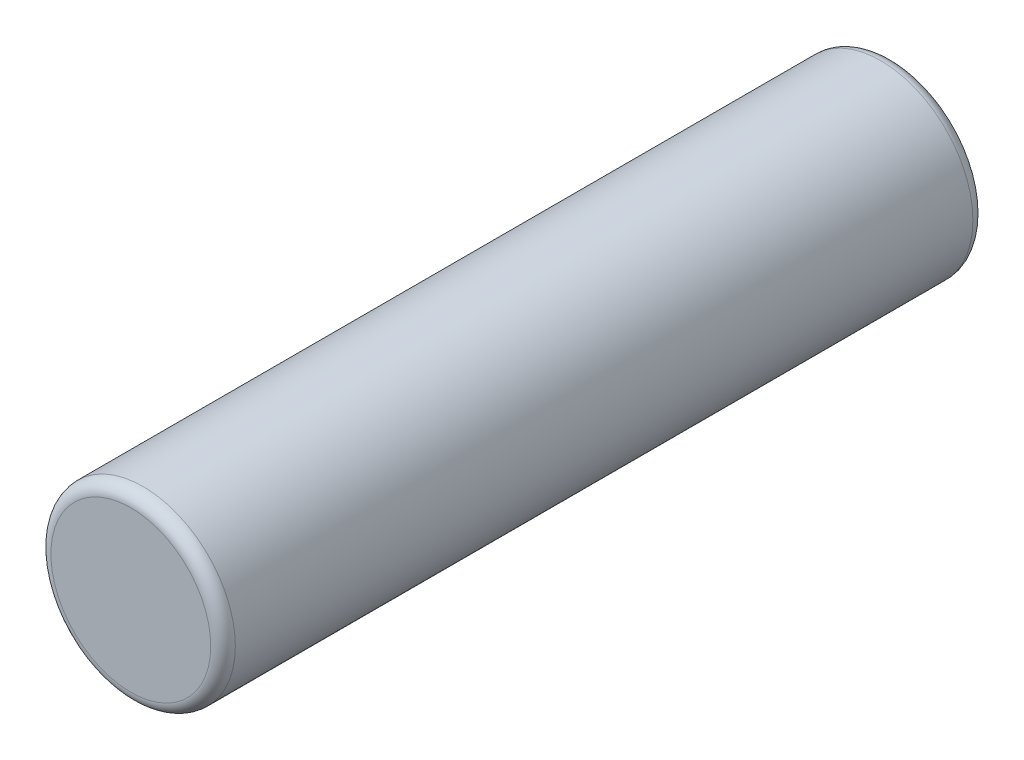
ISO-10303-21;
HEADER;
FILE_DESCRIPTION(('STEP AP214'),'2;1');
FILE_NAME('part.step','',(''),(''),'','','');
FILE_SCHEMA(('AUTOMOTIVE_DESIGN { 1 0 10303 214 1 1 1 1 }'));
ENDSEC;
DATA;
#1=APPLICATION_CONTEXT('core data for automotive mechanical design processes');
#2=APPLICATION_PROTOCOL_DEFINITION('international standard','automotive_design',2000,#1);
#3=PRODUCT_CONTEXT('',#1,'mechanical');
#4=PRODUCT('Part','Part','',(#3));
#5=PRODUCT_RELATED_PRODUCT_CATEGORY('part','',(#4));
#6=PRODUCT_DEFINITION_FORMATION('','',#4);
#7=PRODUCT_DEFINITION_CONTEXT('part definition',#1,'design');
#8=PRODUCT_DEFINITION('design','',#6,#7);
#9=PRODUCT_DEFINITION_SHAPE('','',#8);
#10=(LENGTH_UNIT() NAMED_UNIT(*) SI_UNIT(.MILLI.,.METRE.));
#11=(NAMED_UNIT(*) PLANE_ANGLE_UNIT() SI_UNIT($,.RADIAN.));
#12=(NAMED_UNIT(*) SI_UNIT($,.STERADIAN.) SOLID_ANGLE_UNIT());
#13=UNCERTAINTY_MEASURE_WITH_UNIT(LENGTH_MEASURE(1.E-05),#10,'distance_accuracy_value','');
#14=(GEOMETRIC_REPRESENTATION_CONTEXT(3) GLOBAL_UNCERTAINTY_ASSIGNED_CONTEXT((#13)) GLOBAL_UNIT_ASSIGNED_CONTEXT((#10,
#11,#12)) REPRESENTATION_CONTEXT('',''));
#15=CARTESIAN_POINT('',(0.,0.,0.));
#16=DIRECTION('',(0.,0.,1.));
#17=DIRECTION('',(1.,0.,0.));
#18=AXIS2_PLACEMENT_3D('',#15,#16,#17);
#19=CARTESIAN_POINT('',(0.,0.,62.));
#20=DIRECTION('',(0.,0.,-1.));
#21=DIRECTION('',(-1.,0.,0.));
#22=AXIS2_PLACEMENT_3D('',#19,#20,#21);
#23=CYLINDRICAL_SURFACE('',#22,7.5);
#24=CARTESIAN_POINT('',(0.,0.,1.));
#25=DIRECTION('',(0.,0.,1.));
#26=DIRECTION('',(1.,0.,0.));
#27=AXIS2_PLACEMENT_3D('',#24,#25,#26);
#28=CIRCLE('',#27,7.5);
#29=CARTESIAN_POINT('',(7.5,0.,1.));
#30=VERTEX_POINT('',#29);
#31=EDGE_CURVE('E50',#30,#30,#28,.T.);
#32=ORIENTED_EDGE('',*,*,#31,.T.);
#33=EDGE_LOOP('',(#32));
#34=FACE_BOUND('',#33,.T.);
#35=CARTESIAN_POINT('',(0.,0.,61.));
#36=DIRECTION('',(0.,0.,1.));
#37=DIRECTION('',(1.,0.,0.));
#38=AXIS2_PLACEMENT_3D('',#35,#36,#37);
#39=CIRCLE('',#38,7.5);
#40=CARTESIAN_POINT('',(7.5,0.,61.));
#41=VERTEX_POINT('',#40);
#42=EDGE_CURVE('E55',#41,#41,#39,.F.);
#43=ORIENTED_EDGE('',*,*,#42,.T.);
#44=EDGE_LOOP('',(#43));
#45=FACE_BOUND('',#44,.T.);
#46=ADVANCED_FACE('F37',(#34,#45),#23,.T.);
#47=CARTESIAN_POINT('',(0.,0.,62.));
#48=DIRECTION('',(0.,0.,1.));
#49=DIRECTION('',(1.,0.,0.));
#50=AXIS2_PLACEMENT_3D('',#47,#48,#49);
#51=PLANE('',#50);
#52=CARTESIAN_POINT('',(0.,0.,62.));
#53=DIRECTION('',(0.,0.,1.));
#54=DIRECTION('',(1.,0.,0.));
#55=AXIS2_PLACEMENT_3D('',#52,#53,#54);
#56=CIRCLE('',#55,6.5);
#57=CARTESIAN_POINT('',(6.5,0.,62.));
#58=VERTEX_POINT('',#57);
#59=EDGE_CURVE('E10',#58,#58,#56,.T.);
#60=ORIENTED_EDGE('',*,*,#59,.T.);
#61=EDGE_LOOP('',(#60));
#62=FACE_BOUND('',#61,.T.);
#63=ADVANCED_FACE('F72',(#62),#51,.T.);
#64=CARTESIAN_POINT('',(0.,0.,0.));
#65=DIRECTION('',(0.,0.,1.));
#66=DIRECTION('',(1.,0.,0.));
#67=AXIS2_PLACEMENT_3D('',#64,#65,#66);
#68=PLANE('',#67);
#69=CARTESIAN_POINT('',(0.,0.,0.));
#70=DIRECTION('',(0.,0.,1.));
#71=DIRECTION('',(1.,0.,0.));
#72=AXIS2_PLACEMENT_3D('',#69,#70,#71);
#73=CIRCLE('',#72,6.5);
#74=CARTESIAN_POINT('',(6.5,0.,0.));
#75=VERTEX_POINT('',#74);
#76=EDGE_CURVE('E45',#75,#75,#73,.F.);
#77=ORIENTED_EDGE('',*,*,#76,.T.);
#78=EDGE_LOOP('',(#77));
#79=FACE_BOUND('',#78,.T.);
#80=ADVANCED_FACE('F69',(#79),#68,.F.);
#81=CARTESIAN_POINT('',(0.,0.,1.));
#82=DIRECTION('',(0.,0.,1.));
#83=DIRECTION('',(1.,0.,0.));
#84=AXIS2_PLACEMENT_3D('',#81,#82,#83);
#85=TOROIDAL_SURFACE('',#84,6.5,1.);
#86=ORIENTED_EDGE('',*,*,#76,.F.);
#87=EDGE_LOOP('',(#86));
#88=FACE_BOUND('',#87,.T.);
#89=ORIENTED_EDGE('',*,*,#31,.F.);
#90=EDGE_LOOP('',(#89));
#91=FACE_BOUND('',#90,.T.);
#92=ADVANCED_FACE('F65',(#88,#91),#85,.T.);
#93=CARTESIAN_POINT('',(0.,0.,61.));
#94=DIRECTION('',(0.,0.,1.));
#95=DIRECTION('',(1.,0.,0.));
#96=AXIS2_PLACEMENT_3D('',#93,#94,#95);
#97=TOROIDAL_SURFACE('',#96,6.5,1.);
#98=ORIENTED_EDGE('',*,*,#42,.F.);
#99=EDGE_LOOP('',(#98));
#100=FACE_BOUND('',#99,.T.);
#101=ORIENTED_EDGE('',*,*,#59,.F.);
#102=EDGE_LOOP('',(#101));
#103=FACE_BOUND('',#102,.T.);
#104=ADVANCED_FACE('F39',(#100,#103),#97,.T.);
#105=CLOSED_SHELL('',(#46,#63,#80,#92,#104));
#106=MANIFOLD_SOLID_BREP('B2',#105);
#107=ADVANCED_BREP_SHAPE_REPRESENTATION('',(#18,#106),#14);
#108=SHAPE_DEFINITION_REPRESENTATION(#9,#107);
ENDSEC;
END-ISO-10303-21;
